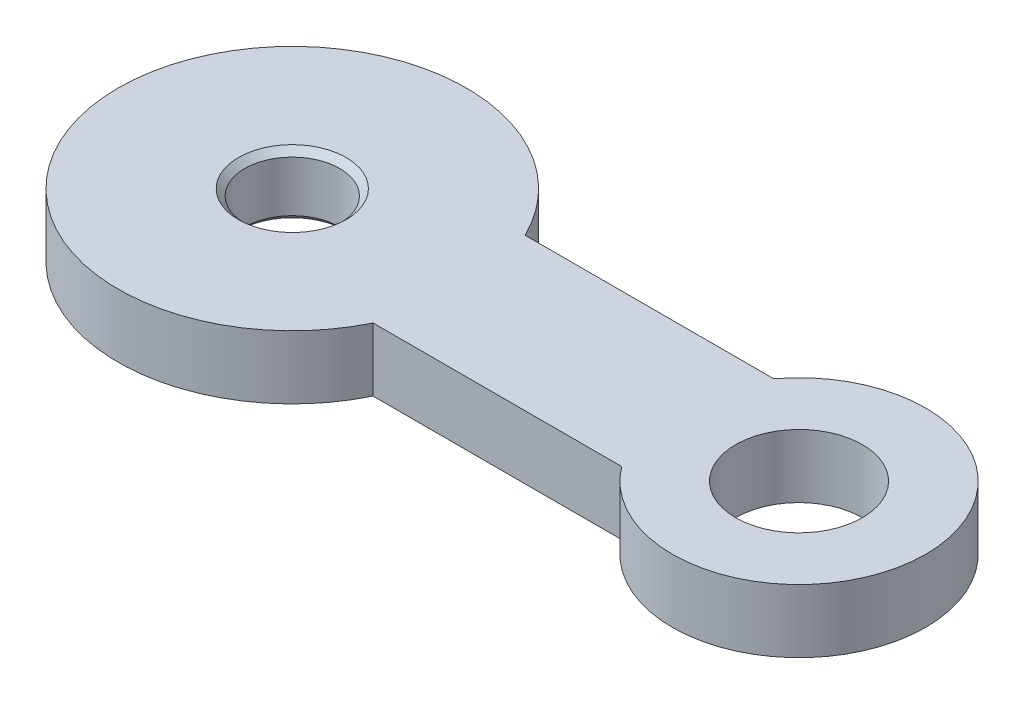
ISO-10303-21;
HEADER;
FILE_DESCRIPTION(('STEP AP214'),'2;1');
FILE_NAME('part.step','',(''),(''),'','','');
FILE_SCHEMA(('AUTOMOTIVE_DESIGN { 1 0 10303 214 1 1 1 1 }'));
ENDSEC;
DATA;
#1=APPLICATION_CONTEXT('core data for automotive mechanical design processes');
#2=APPLICATION_PROTOCOL_DEFINITION('international standard','automotive_design',2000,#1);
#3=PRODUCT_CONTEXT('',#1,'mechanical');
#4=PRODUCT('Part','Part','',(#3));
#5=PRODUCT_RELATED_PRODUCT_CATEGORY('part','',(#4));
#6=PRODUCT_DEFINITION_FORMATION('','',#4);
#7=PRODUCT_DEFINITION_CONTEXT('part definition',#1,'design');
#8=PRODUCT_DEFINITION('design','',#6,#7);
#9=PRODUCT_DEFINITION_SHAPE('','',#8);
#10=(LENGTH_UNIT() NAMED_UNIT(*) SI_UNIT(.MILLI.,.METRE.));
#11=(NAMED_UNIT(*) PLANE_ANGLE_UNIT() SI_UNIT($,.RADIAN.));
#12=(NAMED_UNIT(*) SI_UNIT($,.STERADIAN.) SOLID_ANGLE_UNIT());
#13=UNCERTAINTY_MEASURE_WITH_UNIT(LENGTH_MEASURE(1.E-05),#10,'distance_accuracy_value','');
#14=(GEOMETRIC_REPRESENTATION_CONTEXT(3) GLOBAL_UNCERTAINTY_ASSIGNED_CONTEXT((#13)) GLOBAL_UNIT_ASSIGNED_CONTEXT((#10,
#11,#12)) REPRESENTATION_CONTEXT('',''));
#15=CARTESIAN_POINT('',(0.,0.,0.));
#16=DIRECTION('',(0.,0.,1.));
#17=DIRECTION('',(1.,0.,0.));
#18=AXIS2_PLACEMENT_3D('',#15,#16,#17);
#19=CARTESIAN_POINT('',(101.6,12.7,0.));
#20=DIRECTION('',(0.,1.,0.));
#21=DIRECTION('',(0.,0.,1.));
#22=AXIS2_PLACEMENT_3D('',#19,#20,#21);
#23=PLANE('',#22);
#24=CARTESIAN_POINT('',(0.,12.7,0.));
#25=DIRECTION('',(0.,1.,0.));
#26=DIRECTION('',(0.,0.,1.));
#27=AXIS2_PLACEMENT_3D('',#24,#25,#26);
#28=CIRCLE('',#27,10.795);
#29=CARTESIAN_POINT('',(0.,12.7,10.795));
#30=VERTEX_POINT('',#29);
#31=EDGE_CURVE('E11',#30,#30,#28,.F.);
#32=ORIENTED_EDGE('',*,*,#31,.T.);
#33=EDGE_LOOP('',(#32));
#34=FACE_BOUND('',#33,.T.);
#35=CARTESIAN_POINT('',(101.6,12.7,0.));
#36=DIRECTION('',(0.,1.,0.));
#37=DIRECTION('',(0.,0.,1.));
#38=AXIS2_PLACEMENT_3D('',#35,#36,#37);
#39=CIRCLE('',#38,25.4);
#40=CARTESIAN_POINT('',(81.28,12.7,15.24));
#41=VERTEX_POINT('',#40);
#42=CARTESIAN_POINT('',(81.28,12.7,-15.24));
#43=VERTEX_POINT('',#42);
#44=EDGE_CURVE('E87',#41,#43,#39,.T.);
#45=ORIENTED_EDGE('',*,*,#44,.T.);
#46=DIRECTION('',(-1.,0.,0.));
#47=VECTOR('',#46,1.);
#48=CARTESIAN_POINT('',(31.4244813004129,12.7,-15.24));
#49=LINE('',#48,#47);
#50=CARTESIAN_POINT('',(31.4244813004129,12.7,-15.24));
#51=VERTEX_POINT('',#50);
#52=EDGE_CURVE('E82',#43,#51,#49,.T.);
#53=ORIENTED_EDGE('',*,*,#52,.T.);
#54=CARTESIAN_POINT('',(0.,12.7,0.));
#55=DIRECTION('',(0.,1.,0.));
#56=DIRECTION('',(0.,0.,1.));
#57=AXIS2_PLACEMENT_3D('',#54,#55,#56);
#58=CIRCLE('',#57,34.925);
#59=CARTESIAN_POINT('',(31.4244813004129,12.7,15.24));
#60=VERTEX_POINT('',#59);
#61=EDGE_CURVE('E85',#51,#60,#58,.T.);
#62=ORIENTED_EDGE('',*,*,#61,.T.);
#63=DIRECTION('',(1.,0.,0.));
#64=VECTOR('',#63,1.);
#65=CARTESIAN_POINT('',(81.28,12.7,15.24));
#66=LINE('',#65,#64);
#67=EDGE_CURVE('E51',#60,#41,#66,.T.);
#68=ORIENTED_EDGE('',*,*,#67,.T.);
#69=EDGE_LOOP('',(#45,#53,#62,#68));
#70=FACE_BOUND('',#69,.T.);
#71=CARTESIAN_POINT('',(101.6,12.7,0.));
#72=DIRECTION('',(0.,1.,0.));
#73=DIRECTION('',(0.,0.,1.));
#74=AXIS2_PLACEMENT_3D('',#71,#72,#73);
#75=CIRCLE('',#74,12.7);
#76=CARTESIAN_POINT('',(101.6,12.7,12.7));
#77=VERTEX_POINT('',#76);
#78=EDGE_CURVE('E105',#77,#77,#75,.T.);
#79=ORIENTED_EDGE('',*,*,#78,.F.);
#80=EDGE_LOOP('',(#79));
#81=FACE_BOUND('',#80,.T.);
#82=ADVANCED_FACE('F34',(#34,#70,#81),#23,.T.);
#83=CARTESIAN_POINT('',(101.6,0.,0.));
#84=DIRECTION('',(0.,1.,0.));
#85=DIRECTION('',(0.,0.,1.));
#86=AXIS2_PLACEMENT_3D('',#83,#84,#85);
#87=PLANE('',#86);
#88=CARTESIAN_POINT('',(0.,0.,0.));
#89=DIRECTION('',(0.,1.,0.));
#90=DIRECTION('',(0.,0.,1.));
#91=AXIS2_PLACEMENT_3D('',#88,#89,#90);
#92=CIRCLE('',#91,10.795);
#93=CARTESIAN_POINT('',(0.,0.,10.795));
#94=VERTEX_POINT('',#93);
#95=EDGE_CURVE('E112',#94,#94,#92,.T.);
#96=ORIENTED_EDGE('',*,*,#95,.T.);
#97=EDGE_LOOP('',(#96));
#98=FACE_BOUND('',#97,.T.);
#99=CARTESIAN_POINT('',(101.6,0.,0.));
#100=DIRECTION('',(0.,1.,0.));
#101=DIRECTION('',(0.,0.,1.));
#102=AXIS2_PLACEMENT_3D('',#99,#100,#101);
#103=CIRCLE('',#102,25.4);
#104=CARTESIAN_POINT('',(81.28,0.,15.24));
#105=VERTEX_POINT('',#104);
#106=CARTESIAN_POINT('',(81.28,0.,-15.24));
#107=VERTEX_POINT('',#106);
#108=EDGE_CURVE('E102',#105,#107,#103,.T.);
#109=ORIENTED_EDGE('',*,*,#108,.F.);
#110=DIRECTION('',(1.,0.,0.));
#111=VECTOR('',#110,1.);
#112=CARTESIAN_POINT('',(81.28,0.,15.24));
#113=LINE('',#112,#111);
#114=CARTESIAN_POINT('',(31.4244813004129,0.,15.24));
#115=VERTEX_POINT('',#114);
#116=EDGE_CURVE('E74',#115,#105,#113,.T.);
#117=ORIENTED_EDGE('',*,*,#116,.F.);
#118=CARTESIAN_POINT('',(0.,0.,0.));
#119=DIRECTION('',(0.,1.,0.));
#120=DIRECTION('',(0.,0.,1.));
#121=AXIS2_PLACEMENT_3D('',#118,#119,#120);
#122=CIRCLE('',#121,34.925);
#123=CARTESIAN_POINT('',(31.4244813004129,0.,-15.24));
#124=VERTEX_POINT('',#123);
#125=EDGE_CURVE('E68',#124,#115,#122,.T.);
#126=ORIENTED_EDGE('',*,*,#125,.F.);
#127=DIRECTION('',(-1.,0.,0.));
#128=VECTOR('',#127,1.);
#129=CARTESIAN_POINT('',(31.4244813004129,0.,-15.24));
#130=LINE('',#129,#128);
#131=EDGE_CURVE('E92',#107,#124,#130,.T.);
#132=ORIENTED_EDGE('',*,*,#131,.F.);
#133=EDGE_LOOP('',(#109,#117,#126,#132));
#134=FACE_BOUND('',#133,.T.);
#135=CARTESIAN_POINT('',(101.6,0.,0.));
#136=DIRECTION('',(0.,1.,0.));
#137=DIRECTION('',(0.,0.,1.));
#138=AXIS2_PLACEMENT_3D('',#135,#136,#137);
#139=CIRCLE('',#138,12.7);
#140=CARTESIAN_POINT('',(101.6,0.,12.7));
#141=VERTEX_POINT('',#140);
#142=EDGE_CURVE('E138',#141,#141,#139,.T.);
#143=ORIENTED_EDGE('',*,*,#142,.T.);
#144=EDGE_LOOP('',(#143));
#145=FACE_BOUND('',#144,.T.);
#146=ADVANCED_FACE('F129',(#98,#134,#145),#87,.F.);
#147=CARTESIAN_POINT('',(101.6,12.7,0.));
#148=DIRECTION('',(0.,-1.,0.));
#149=DIRECTION('',(0.,0.,-1.));
#150=AXIS2_PLACEMENT_3D('',#147,#148,#149);
#151=CYLINDRICAL_SURFACE('',#150,25.4);
#152=ORIENTED_EDGE('',*,*,#108,.T.);
#153=DIRECTION('',(0.,-1.,0.));
#154=VECTOR('',#153,1.);
#155=CARTESIAN_POINT('',(81.28,12.7,-15.24));
#156=LINE('',#155,#154);
#157=EDGE_CURVE('E93',#43,#107,#156,.T.);
#158=ORIENTED_EDGE('',*,*,#157,.F.);
#159=ORIENTED_EDGE('',*,*,#44,.F.);
#160=DIRECTION('',(0.,-1.,0.));
#161=VECTOR('',#160,1.);
#162=CARTESIAN_POINT('',(81.28,12.7,15.24));
#163=LINE('',#162,#161);
#164=EDGE_CURVE('E98',#41,#105,#163,.T.);
#165=ORIENTED_EDGE('',*,*,#164,.T.);
#166=EDGE_LOOP('',(#152,#158,#159,#165));
#167=FACE_BOUND('',#166,.T.);
#168=ADVANCED_FACE('F132',(#167),#151,.T.);
#169=CARTESIAN_POINT('',(31.4244813004129,12.7,-15.24));
#170=DIRECTION('',(0.,0.,1.));
#171=DIRECTION('',(1.,0.,0.));
#172=AXIS2_PLACEMENT_3D('',#169,#170,#171);
#173=PLANE('',#172);
#174=ORIENTED_EDGE('',*,*,#131,.T.);
#175=DIRECTION('',(0.,-1.,0.));
#176=VECTOR('',#175,1.);
#177=CARTESIAN_POINT('',(31.4244813004129,12.7,-15.24));
#178=LINE('',#177,#176);
#179=EDGE_CURVE('E90',#51,#124,#178,.T.);
#180=ORIENTED_EDGE('',*,*,#179,.F.);
#181=ORIENTED_EDGE('',*,*,#52,.F.);
#182=ORIENTED_EDGE('',*,*,#157,.T.);
#183=EDGE_LOOP('',(#174,#180,#181,#182));
#184=FACE_BOUND('',#183,.T.);
#185=ADVANCED_FACE('F91',(#184),#173,.F.);
#186=CARTESIAN_POINT('',(0.,12.7,0.));
#187=DIRECTION('',(0.,-1.,0.));
#188=DIRECTION('',(0.,0.,-1.));
#189=AXIS2_PLACEMENT_3D('',#186,#187,#188);
#190=CYLINDRICAL_SURFACE('',#189,34.925);
#191=ORIENTED_EDGE('',*,*,#125,.T.);
#192=DIRECTION('',(0.,-1.,0.));
#193=VECTOR('',#192,1.);
#194=CARTESIAN_POINT('',(31.4244813004129,12.7,15.24));
#195=LINE('',#194,#193);
#196=EDGE_CURVE('E94',#60,#115,#195,.T.);
#197=ORIENTED_EDGE('',*,*,#196,.F.);
#198=ORIENTED_EDGE('',*,*,#61,.F.);
#199=ORIENTED_EDGE('',*,*,#179,.T.);
#200=EDGE_LOOP('',(#191,#197,#198,#199));
#201=FACE_BOUND('',#200,.T.);
#202=ADVANCED_FACE('F96',(#201),#190,.T.);
#203=CARTESIAN_POINT('',(81.28,12.7,15.24));
#204=DIRECTION('',(0.,0.,-1.));
#205=DIRECTION('',(-1.,0.,0.));
#206=AXIS2_PLACEMENT_3D('',#203,#204,#205);
#207=PLANE('',#206);
#208=ORIENTED_EDGE('',*,*,#116,.T.);
#209=ORIENTED_EDGE('',*,*,#164,.F.);
#210=ORIENTED_EDGE('',*,*,#67,.F.);
#211=ORIENTED_EDGE('',*,*,#196,.T.);
#212=EDGE_LOOP('',(#208,#209,#210,#211));
#213=FACE_BOUND('',#212,.T.);
#214=ADVANCED_FACE('F153',(#213),#207,.F.);
#215=CARTESIAN_POINT('',(0.,12.7,0.));
#216=DIRECTION('',(0.,-1.,0.));
#217=DIRECTION('',(0.,0.,-1.));
#218=AXIS2_PLACEMENT_3D('',#215,#216,#217);
#219=CYLINDRICAL_SURFACE('',#218,9.525);
#220=CARTESIAN_POINT('',(0.,1.26999999999999,0.));
#221=DIRECTION('',(0.,1.,0.));
#222=DIRECTION('',(0.,0.,1.));
#223=AXIS2_PLACEMENT_3D('',#220,#221,#222);
#224=CIRCLE('',#223,9.525);
#225=CARTESIAN_POINT('',(0.,1.26999999999999,9.525));
#226=VERTEX_POINT('',#225);
#227=EDGE_CURVE('E43',#226,#226,#224,.F.);
#228=ORIENTED_EDGE('',*,*,#227,.T.);
#229=EDGE_LOOP('',(#228));
#230=FACE_BOUND('',#229,.T.);
#231=CARTESIAN_POINT('',(0.,11.43,0.));
#232=DIRECTION('',(0.,1.,0.));
#233=DIRECTION('',(0.,0.,1.));
#234=AXIS2_PLACEMENT_3D('',#231,#232,#233);
#235=CIRCLE('',#234,9.525);
#236=CARTESIAN_POINT('',(0.,11.43,9.525));
#237=VERTEX_POINT('',#236);
#238=EDGE_CURVE('E115',#237,#237,#235,.T.);
#239=ORIENTED_EDGE('',*,*,#238,.T.);
#240=EDGE_LOOP('',(#239));
#241=FACE_BOUND('',#240,.T.);
#242=ADVANCED_FACE('F120',(#230,#241),#219,.F.);
#243=CARTESIAN_POINT('',(101.6,12.7,0.));
#244=DIRECTION('',(0.,-1.,0.));
#245=DIRECTION('',(0.,0.,-1.));
#246=AXIS2_PLACEMENT_3D('',#243,#244,#245);
#247=CYLINDRICAL_SURFACE('',#246,12.7);
#248=ORIENTED_EDGE('',*,*,#78,.T.);
#249=EDGE_LOOP('',(#248));
#250=FACE_BOUND('',#249,.T.);
#251=ORIENTED_EDGE('',*,*,#142,.F.);
#252=EDGE_LOOP('',(#251));
#253=FACE_BOUND('',#252,.T.);
#254=ADVANCED_FACE('F126',(#250,#253),#247,.F.);
#255=CARTESIAN_POINT('',(0.,0.,0.));
#256=DIRECTION('',(0.,-1.,0.));
#257=DIRECTION('',(0.,0.,-1.));
#258=AXIS2_PLACEMENT_3D('',#255,#256,#257);
#259=CONICAL_SURFACE('',#258,10.795,0.785398163397445);
#260=ORIENTED_EDGE('',*,*,#227,.F.);
#261=EDGE_LOOP('',(#260));
#262=FACE_BOUND('',#261,.T.);
#263=ORIENTED_EDGE('',*,*,#95,.F.);
#264=EDGE_LOOP('',(#263));
#265=FACE_BOUND('',#264,.T.);
#266=ADVANCED_FACE('F123',(#262,#265),#259,.F.);
#267=CARTESIAN_POINT('',(0.,11.43,0.));
#268=DIRECTION('',(0.,1.,0.));
#269=DIRECTION('',(0.,0.,1.));
#270=AXIS2_PLACEMENT_3D('',#267,#268,#269);
#271=CONICAL_SURFACE('',#270,9.525,0.785398163397452);
#272=ORIENTED_EDGE('',*,*,#31,.F.);
#273=EDGE_LOOP('',(#272));
#274=FACE_BOUND('',#273,.T.);
#275=ORIENTED_EDGE('',*,*,#238,.F.);
#276=EDGE_LOOP('',(#275));
#277=FACE_BOUND('',#276,.T.);
#278=ADVANCED_FACE('F36',(#274,#277),#271,.F.);
#279=CLOSED_SHELL('',(#82,#146,#168,#185,#202,#214,#242,#254,#266,#278));
#280=MANIFOLD_SOLID_BREP('B2',#279);
#281=ADVANCED_BREP_SHAPE_REPRESENTATION('',(#18,#280),#14);
#282=SHAPE_DEFINITION_REPRESENTATION(#9,#281);
ENDSEC;
END-ISO-10303-21;
